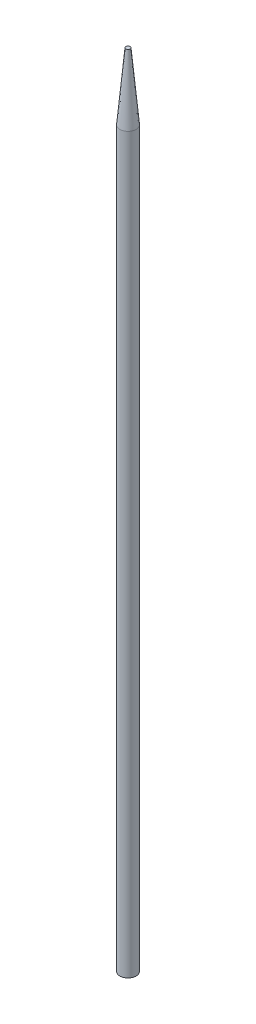
ISO-10303-21;
HEADER;
FILE_DESCRIPTION(('STEP AP214'),'2;1');
FILE_NAME('part.step','',(''),(''),'','','');
FILE_SCHEMA(('AUTOMOTIVE_DESIGN { 1 0 10303 214 1 1 1 1 }'));
ENDSEC;
DATA;
#1=APPLICATION_CONTEXT('core data for automotive mechanical design processes');
#2=APPLICATION_PROTOCOL_DEFINITION('international standard','automotive_design',2000,#1);
#3=PRODUCT_CONTEXT('',#1,'mechanical');
#4=PRODUCT('Part','Part','',(#3));
#5=PRODUCT_RELATED_PRODUCT_CATEGORY('part','',(#4));
#6=PRODUCT_DEFINITION_FORMATION('','',#4);
#7=PRODUCT_DEFINITION_CONTEXT('part definition',#1,'design');
#8=PRODUCT_DEFINITION('design','',#6,#7);
#9=PRODUCT_DEFINITION_SHAPE('','',#8);
#10=(LENGTH_UNIT() NAMED_UNIT(*) SI_UNIT(.MILLI.,.METRE.));
#11=(NAMED_UNIT(*) PLANE_ANGLE_UNIT() SI_UNIT($,.RADIAN.));
#12=(NAMED_UNIT(*) SI_UNIT($,.STERADIAN.) SOLID_ANGLE_UNIT());
#13=UNCERTAINTY_MEASURE_WITH_UNIT(LENGTH_MEASURE(1.E-05),#10,'distance_accuracy_value','');
#14=(GEOMETRIC_REPRESENTATION_CONTEXT(3) GLOBAL_UNCERTAINTY_ASSIGNED_CONTEXT((#13)) GLOBAL_UNIT_ASSIGNED_CONTEXT((#10,
#11,#12)) REPRESENTATION_CONTEXT('',''));
#15=CARTESIAN_POINT('',(0.,0.,0.));
#16=DIRECTION('',(0.,0.,1.));
#17=DIRECTION('',(1.,0.,0.));
#18=AXIS2_PLACEMENT_3D('',#15,#16,#17);
#19=CARTESIAN_POINT('',(0.,0.,-1.5494));
#20=DIRECTION('',(0.,-1.,0.));
#21=DIRECTION('',(0.,0.,-1.));
#22=AXIS2_PLACEMENT_3D('',#19,#20,#21);
#23=PLANE('',#22);
#24=CARTESIAN_POINT('',(0.,0.,0.));
#25=DIRECTION('',(0.,-1.,0.));
#26=DIRECTION('',(0.,0.,-1.));
#27=AXIS2_PLACEMENT_3D('',#24,#25,#26);
#28=CIRCLE('',#27,1.5494);
#29=CARTESIAN_POINT('',(0.,0.,-1.5494));
#30=VERTEX_POINT('',#29);
#31=EDGE_CURVE('E55',#30,#30,#28,.T.);
#32=ORIENTED_EDGE('',*,*,#31,.T.);
#33=EDGE_LOOP('',(#32));
#34=FACE_BOUND('',#33,.T.);
#35=ADVANCED_FACE('F43',(#34),#23,.T.);
#36=CARTESIAN_POINT('',(0.,152.4,0.));
#37=DIRECTION('',(0.,1.,0.));
#38=DIRECTION('',(0.,0.,1.));
#39=AXIS2_PLACEMENT_3D('',#36,#37,#38);
#40=PLANE('',#39);
#41=CARTESIAN_POINT('',(0.,152.4,0.));
#42=DIRECTION('',(0.,-1.,0.));
#43=DIRECTION('',(0.,0.,-1.));
#44=AXIS2_PLACEMENT_3D('',#41,#42,#43);
#45=CIRCLE('',#44,0.4064);
#46=CARTESIAN_POINT('',(0.,152.4,-0.406399999999999));
#47=VERTEX_POINT('',#46);
#48=EDGE_CURVE('E10',#47,#47,#45,.T.);
#49=ORIENTED_EDGE('',*,*,#48,.F.);
#50=EDGE_LOOP('',(#49));
#51=FACE_BOUND('',#50,.T.);
#52=ADVANCED_FACE('F71',(#51),#40,.T.);
#53=CARTESIAN_POINT('',(0.,139.7,0.));
#54=DIRECTION('',(0.,-1.,0.));
#55=DIRECTION('',(0.,0.,-1.));
#56=AXIS2_PLACEMENT_3D('',#53,#54,#55);
#57=CONICAL_SURFACE('',#56,1.54939999999998,0.0897581741899492);
#58=CARTESIAN_POINT('',(0.,139.7,0.));
#59=DIRECTION('',(0.,-1.,0.));
#60=DIRECTION('',(0.,0.,-1.));
#61=AXIS2_PLACEMENT_3D('',#58,#59,#60);
#62=CIRCLE('',#61,1.54939999999998);
#63=CARTESIAN_POINT('',(0.,139.7,-1.54939999999998));
#64=VERTEX_POINT('',#63);
#65=EDGE_CURVE('E50',#64,#64,#62,.T.);
#66=CARTESIAN_POINT('',(0.,152.4,-0.406399999999999));
#67=CARTESIAN_POINT('',(0.,152.267708333333,-0.418306249999999));
#68=CARTESIAN_POINT('',(0.,152.135416666667,-0.430212499999999));
#69=CARTESIAN_POINT('',(0.,151.870833333333,-0.454024999999998));
#70=CARTESIAN_POINT('',(0.,151.738541666667,-0.465931249999998));
#71=CARTESIAN_POINT('',(0.,151.473958333333,-0.489743749999998));
#72=CARTESIAN_POINT('',(0.,151.341666666667,-0.501649999999998));
#73=CARTESIAN_POINT('',(0.,151.077083333333,-0.525462499999998));
#74=CARTESIAN_POINT('',(0.,150.944791666667,-0.537368749999997));
#75=CARTESIAN_POINT('',(0.,150.680208333333,-0.561181249999996));
#76=CARTESIAN_POINT('',(0.,150.547916666667,-0.573087499999996));
#77=CARTESIAN_POINT('',(0.,150.283333333333,-0.596899999999996));
#78=CARTESIAN_POINT('',(0.,150.151041666667,-0.608806249999997));
#79=CARTESIAN_POINT('',(0.,149.886458333333,-0.632618749999996));
#80=CARTESIAN_POINT('',(0.,149.754166666667,-0.644524999999995));
#81=CARTESIAN_POINT('',(0.,149.489583333333,-0.668337499999994));
#82=CARTESIAN_POINT('',(0.,149.357291666667,-0.680243749999995));
#83=CARTESIAN_POINT('',(0.,149.092708333333,-0.704056249999995));
#84=CARTESIAN_POINT('',(0.,148.960416666667,-0.715962499999995));
#85=CARTESIAN_POINT('',(0.,148.695833333333,-0.739774999999994));
#86=CARTESIAN_POINT('',(0.,148.563541666667,-0.751681249999994));
#87=CARTESIAN_POINT('',(0.,148.298958333333,-0.775493749999993));
#88=CARTESIAN_POINT('',(0.,148.166666666667,-0.787399999999993));
#89=CARTESIAN_POINT('',(0.,147.902083333333,-0.811212499999993));
#90=CARTESIAN_POINT('',(0.,147.769791666667,-0.823118749999993));
#91=CARTESIAN_POINT('',(0.,147.505208333333,-0.846931249999992));
#92=CARTESIAN_POINT('',(0.,147.372916666667,-0.858837499999992));
#93=CARTESIAN_POINT('',(0.,147.108333333333,-0.882649999999991));
#94=CARTESIAN_POINT('',(0.,146.976041666667,-0.894556249999991));
#95=CARTESIAN_POINT('',(0.,146.711458333333,-0.918368749999991));
#96=CARTESIAN_POINT('',(0.,146.579166666667,-0.930274999999991));
#97=CARTESIAN_POINT('',(0.,146.314583333333,-0.954087499999991));
#98=CARTESIAN_POINT('',(0.,146.182291666667,-0.965993749999991));
#99=CARTESIAN_POINT('',(0.,145.917708333333,-0.989806249999991));
#100=CARTESIAN_POINT('',(0.,145.785416666667,-1.00171249999999));
#101=CARTESIAN_POINT('',(0.,145.520833333333,-1.02552499999999));
#102=CARTESIAN_POINT('',(0.,145.388541666667,-1.03743124999999));
#103=CARTESIAN_POINT('',(0.,145.123958333333,-1.06124374999999));
#104=CARTESIAN_POINT('',(0.,144.991666666667,-1.07314999999999));
#105=CARTESIAN_POINT('',(0.,144.727083333333,-1.09696249999999));
#106=CARTESIAN_POINT('',(0.,144.594791666667,-1.10886874999999));
#107=CARTESIAN_POINT('',(0.,144.330208333333,-1.13268124999999));
#108=CARTESIAN_POINT('',(0.,144.197916666667,-1.14458749999999));
#109=CARTESIAN_POINT('',(0.,143.933333333333,-1.16839999999999));
#110=CARTESIAN_POINT('',(0.,143.801041666667,-1.18030624999999));
#111=CARTESIAN_POINT('',(0.,143.536458333333,-1.20411874999999));
#112=CARTESIAN_POINT('',(0.,143.404166666667,-1.21602499999999));
#113=CARTESIAN_POINT('',(0.,143.139583333333,-1.23983749999999));
#114=CARTESIAN_POINT('',(0.,143.007291666667,-1.25174374999999));
#115=CARTESIAN_POINT('',(0.,142.742708333333,-1.27555624999999));
#116=CARTESIAN_POINT('',(0.,142.610416666667,-1.28746249999999));
#117=CARTESIAN_POINT('',(0.,142.345833333333,-1.31127499999999));
#118=CARTESIAN_POINT('',(0.,142.213541666667,-1.32318124999998));
#119=CARTESIAN_POINT('',(0.,141.948958333333,-1.34699374999998));
#120=CARTESIAN_POINT('',(0.,141.816666666667,-1.35889999999998));
#121=CARTESIAN_POINT('',(0.,141.552083333333,-1.38271249999998));
#122=CARTESIAN_POINT('',(0.,141.419791666667,-1.39461874999998));
#123=CARTESIAN_POINT('',(0.,141.155208333333,-1.41843124999998));
#124=CARTESIAN_POINT('',(0.,141.022916666667,-1.43033749999998));
#125=CARTESIAN_POINT('',(0.,140.758333333333,-1.45414999999998));
#126=CARTESIAN_POINT('',(0.,140.626041666667,-1.46605624999998));
#127=CARTESIAN_POINT('',(0.,140.361458333333,-1.48986874999998));
#128=CARTESIAN_POINT('',(0.,140.229166666667,-1.50177499999998));
#129=CARTESIAN_POINT('',(0.,139.964583333333,-1.52558749999998));
#130=CARTESIAN_POINT('',(0.,139.832291666667,-1.53749374999998));
#131=CARTESIAN_POINT('',(0.,139.7,-1.54939999999998));
#132=B_SPLINE_CURVE_WITH_KNOTS('',3,(#66,#67,#68,#69,#70,#71,#72,#73,#74,#75,#76,#77,#78,#79,
#80,#81,#82,#83,#84,#85,#86,#87,#88,#89,#90,#91,#92,#93,#94,#95,#96,#97,#98,#99,#100,#101,#102,
#103,#104,#105,#106,#107,#108,#109,#110,#111,#112,#113,#114,#115,#116,#117,#118,#119,#120,#121,
#122,#123,#124,#125,#126,#127,#128,#129,#130,#131),.UNSPECIFIED.,.F.,.F.,(4,2,2,2,2,2,2,2,2,2,2,
2,2,2,2,2,2,2,2,2,2,2,2,2,2,2,2,2,2,2,2,2,4),(0.,0.398479101994766,0.796958203989532,
1.1954373059843,1.59391640797909,1.99239550997386,2.39087461196862,2.78935371396342,
3.18783281595818,3.58631191795295,3.98479101994774,4.38327012194251,4.78174922393728,
5.18022832593207,5.57870742792684,5.9771865299216,6.37566563191637,6.77414473391116,
7.17262383590593,7.5711029379007,7.96958203989549,8.36806114189026,8.76654024388502,
9.16501934587982,9.56349844787458,9.96197754986935,10.3604566518641,10.7589357538589,
11.1574148558537,11.5558939578485,11.9543730598432,12.352852161838,12.7513312638328),.UNSPECIFIED.);
#133=EDGE_CURVE('BSEAM66',#47,#64,#132,.T.);
#134=ORIENTED_EDGE('',*,*,#48,.T.);
#135=ORIENTED_EDGE('',*,*,#65,.F.);
#136=ORIENTED_EDGE('',*,*,#133,.T.);
#137=ORIENTED_EDGE('',*,*,#133,.F.);
#138=EDGE_LOOP('',(#134,#136,#135,#137));
#139=FACE_BOUND('',#138,.T.);
#140=ADVANCED_FACE('F66',(#139),#57,.T.);
#141=CARTESIAN_POINT('',(0.,0.,0.));
#142=DIRECTION('',(0.,-1.,0.));
#143=DIRECTION('',(0.,0.,-1.));
#144=AXIS2_PLACEMENT_3D('',#141,#142,#143);
#145=CYLINDRICAL_SURFACE('',#144,1.54939999999999);
#146=ORIENTED_EDGE('',*,*,#65,.T.);
#147=EDGE_LOOP('',(#146));
#148=FACE_BOUND('',#147,.T.);
#149=ORIENTED_EDGE('',*,*,#31,.F.);
#150=EDGE_LOOP('',(#149));
#151=FACE_BOUND('',#150,.T.);
#152=ADVANCED_FACE('F64',(#148,#151),#145,.T.);
#153=CLOSED_SHELL('',(#35,#52,#140,#152));
#154=MANIFOLD_SOLID_BREP('B2',#153);
#155=ADVANCED_BREP_SHAPE_REPRESENTATION('',(#18,#154),#14);
#156=SHAPE_DEFINITION_REPRESENTATION(#9,#155);
ENDSEC;
END-ISO-10303-21;
